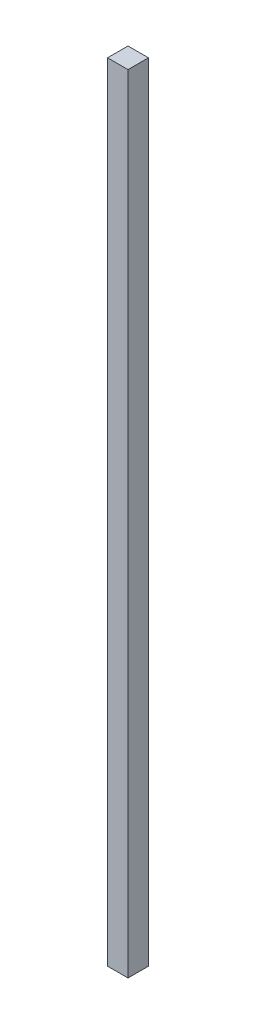
ISO-10303-21;
HEADER;
FILE_DESCRIPTION(('STEP AP214'),'2;1');
FILE_NAME('part.step','',(''),(''),'','','');
FILE_SCHEMA(('AUTOMOTIVE_DESIGN { 1 0 10303 214 1 1 1 1 }'));
ENDSEC;
DATA;
#1=APPLICATION_CONTEXT('core data for automotive mechanical design processes');
#2=APPLICATION_PROTOCOL_DEFINITION('international standard','automotive_design',2000,#1);
#3=PRODUCT_CONTEXT('',#1,'mechanical');
#4=PRODUCT('Part','Part','',(#3));
#5=PRODUCT_RELATED_PRODUCT_CATEGORY('part','',(#4));
#6=PRODUCT_DEFINITION_FORMATION('','',#4);
#7=PRODUCT_DEFINITION_CONTEXT('part definition',#1,'design');
#8=PRODUCT_DEFINITION('design','',#6,#7);
#9=PRODUCT_DEFINITION_SHAPE('','',#8);
#10=(LENGTH_UNIT() NAMED_UNIT(*) SI_UNIT(.MILLI.,.METRE.));
#11=(NAMED_UNIT(*) PLANE_ANGLE_UNIT() SI_UNIT($,.RADIAN.));
#12=(NAMED_UNIT(*) SI_UNIT($,.STERADIAN.) SOLID_ANGLE_UNIT());
#13=UNCERTAINTY_MEASURE_WITH_UNIT(LENGTH_MEASURE(1.E-05),#10,'distance_accuracy_value','');
#14=(GEOMETRIC_REPRESENTATION_CONTEXT(3) GLOBAL_UNCERTAINTY_ASSIGNED_CONTEXT((#13)) GLOBAL_UNIT_ASSIGNED_CONTEXT((#10,
#11,#12)) REPRESENTATION_CONTEXT('',''));
#15=CARTESIAN_POINT('',(0.,0.,0.));
#16=DIRECTION('',(0.,0.,1.));
#17=DIRECTION('',(1.,0.,0.));
#18=AXIS2_PLACEMENT_3D('',#15,#16,#17);
#19=CARTESIAN_POINT('',(6.35,244.475,6.35000000000002));
#20=DIRECTION('',(-1.,0.,0.));
#21=DIRECTION('',(0.,0.,1.));
#22=AXIS2_PLACEMENT_3D('',#19,#20,#21);
#23=PLANE('',#22);
#24=DIRECTION('',(0.,0.,-1.));
#25=VECTOR('',#24,1.);
#26=CARTESIAN_POINT('',(6.35,-244.475,6.35000000000002));
#27=LINE('',#26,#25);
#28=CARTESIAN_POINT('',(6.35,-244.475,6.35000000000002));
#29=VERTEX_POINT('',#28);
#30=CARTESIAN_POINT('',(6.35,-244.475,-6.35000000000002));
#31=VERTEX_POINT('',#30);
#32=EDGE_CURVE('E107',#29,#31,#27,.T.);
#33=ORIENTED_EDGE('',*,*,#32,.T.);
#34=DIRECTION('',(0.,-1.,0.));
#35=VECTOR('',#34,1.);
#36=CARTESIAN_POINT('',(6.35,244.475,-6.35000000000002));
#37=LINE('',#36,#35);
#38=CARTESIAN_POINT('',(6.35,244.475,-6.35000000000002));
#39=VERTEX_POINT('',#38);
#40=EDGE_CURVE('E11',#39,#31,#37,.T.);
#41=ORIENTED_EDGE('',*,*,#40,.F.);
#42=DIRECTION('',(0.,0.,-1.));
#43=VECTOR('',#42,1.);
#44=CARTESIAN_POINT('',(6.35,244.475,6.35000000000002));
#45=LINE('',#44,#43);
#46=CARTESIAN_POINT('',(6.35,244.475,6.35000000000002));
#47=VERTEX_POINT('',#46);
#48=EDGE_CURVE('E91',#47,#39,#45,.T.);
#49=ORIENTED_EDGE('',*,*,#48,.F.);
#50=DIRECTION('',(0.,-1.,0.));
#51=VECTOR('',#50,1.);
#52=CARTESIAN_POINT('',(6.35,244.475,6.35000000000002));
#53=LINE('',#52,#51);
#54=EDGE_CURVE('E103',#47,#29,#53,.T.);
#55=ORIENTED_EDGE('',*,*,#54,.T.);
#56=EDGE_LOOP('',(#33,#41,#49,#55));
#57=FACE_BOUND('',#56,.T.);
#58=ADVANCED_FACE('F39',(#57),#23,.F.);
#59=CARTESIAN_POINT('',(-6.35,244.475,-6.35000000000002));
#60=DIRECTION('',(0.,0.,1.));
#61=DIRECTION('',(1.,0.,0.));
#62=AXIS2_PLACEMENT_3D('',#59,#60,#61);
#63=PLANE('',#62);
#64=DIRECTION('',(-1.,0.,0.));
#65=VECTOR('',#64,1.);
#66=CARTESIAN_POINT('',(-6.35,-244.475,-6.35000000000002));
#67=LINE('',#66,#65);
#68=CARTESIAN_POINT('',(-6.35,-244.475,-6.35000000000002));
#69=VERTEX_POINT('',#68);
#70=EDGE_CURVE('E96',#31,#69,#67,.T.);
#71=ORIENTED_EDGE('',*,*,#70,.T.);
#72=DIRECTION('',(0.,-1.,0.));
#73=VECTOR('',#72,1.);
#74=CARTESIAN_POINT('',(-6.35,244.475,-6.35000000000002));
#75=LINE('',#74,#73);
#76=CARTESIAN_POINT('',(-6.35,244.475,-6.35000000000002));
#77=VERTEX_POINT('',#76);
#78=EDGE_CURVE('E48',#77,#69,#75,.T.);
#79=ORIENTED_EDGE('',*,*,#78,.F.);
#80=DIRECTION('',(-1.,0.,0.));
#81=VECTOR('',#80,1.);
#82=CARTESIAN_POINT('',(-6.35,244.475,-6.35000000000002));
#83=LINE('',#82,#81);
#84=EDGE_CURVE('E86',#39,#77,#83,.T.);
#85=ORIENTED_EDGE('',*,*,#84,.F.);
#86=ORIENTED_EDGE('',*,*,#40,.T.);
#87=EDGE_LOOP('',(#71,#79,#85,#86));
#88=FACE_BOUND('',#87,.T.);
#89=ADVANCED_FACE('F95',(#88),#63,.F.);
#90=CARTESIAN_POINT('',(-6.35,244.475,6.35000000000002));
#91=DIRECTION('',(1.,0.,0.));
#92=DIRECTION('',(0.,0.,-1.));
#93=AXIS2_PLACEMENT_3D('',#90,#91,#92);
#94=PLANE('',#93);
#95=DIRECTION('',(0.,0.,1.));
#96=VECTOR('',#95,1.);
#97=CARTESIAN_POINT('',(-6.35,-244.475,6.35000000000002));
#98=LINE('',#97,#96);
#99=CARTESIAN_POINT('',(-6.35,-244.475,6.35000000000002));
#100=VERTEX_POINT('',#99);
#101=EDGE_CURVE('E73',#69,#100,#98,.T.);
#102=ORIENTED_EDGE('',*,*,#101,.T.);
#103=DIRECTION('',(0.,-1.,0.));
#104=VECTOR('',#103,1.);
#105=CARTESIAN_POINT('',(-6.35,244.475,6.35000000000002));
#106=LINE('',#105,#104);
#107=CARTESIAN_POINT('',(-6.35,244.475,6.35000000000002));
#108=VERTEX_POINT('',#107);
#109=EDGE_CURVE('E98',#108,#100,#106,.T.);
#110=ORIENTED_EDGE('',*,*,#109,.F.);
#111=DIRECTION('',(0.,0.,1.));
#112=VECTOR('',#111,1.);
#113=CARTESIAN_POINT('',(-6.35,244.475,6.35000000000002));
#114=LINE('',#113,#112);
#115=EDGE_CURVE('E89',#77,#108,#114,.T.);
#116=ORIENTED_EDGE('',*,*,#115,.F.);
#117=ORIENTED_EDGE('',*,*,#78,.T.);
#118=EDGE_LOOP('',(#102,#110,#116,#117));
#119=FACE_BOUND('',#118,.T.);
#120=ADVANCED_FACE('F99',(#119),#94,.F.);
#121=CARTESIAN_POINT('',(-6.35,244.475,6.35000000000002));
#122=DIRECTION('',(0.,0.,-1.));
#123=DIRECTION('',(-1.,0.,0.));
#124=AXIS2_PLACEMENT_3D('',#121,#122,#123);
#125=PLANE('',#124);
#126=DIRECTION('',(1.,0.,0.));
#127=VECTOR('',#126,1.);
#128=CARTESIAN_POINT('',(-6.35,-244.475,6.35000000000002));
#129=LINE('',#128,#127);
#130=EDGE_CURVE('E79',#100,#29,#129,.T.);
#131=ORIENTED_EDGE('',*,*,#130,.T.);
#132=ORIENTED_EDGE('',*,*,#54,.F.);
#133=DIRECTION('',(1.,0.,0.));
#134=VECTOR('',#133,1.);
#135=CARTESIAN_POINT('',(-6.35,244.475,6.35000000000002));
#136=LINE('',#135,#134);
#137=EDGE_CURVE('E56',#108,#47,#136,.T.);
#138=ORIENTED_EDGE('',*,*,#137,.F.);
#139=ORIENTED_EDGE('',*,*,#109,.T.);
#140=EDGE_LOOP('',(#131,#132,#138,#139));
#141=FACE_BOUND('',#140,.T.);
#142=ADVANCED_FACE('F120',(#141),#125,.F.);
#143=CARTESIAN_POINT('',(0.,244.475,0.));
#144=DIRECTION('',(0.,-1.,0.));
#145=DIRECTION('',(0.,0.,-1.));
#146=AXIS2_PLACEMENT_3D('',#143,#144,#145);
#147=PLANE('',#146);
#148=ORIENTED_EDGE('',*,*,#48,.T.);
#149=ORIENTED_EDGE('',*,*,#84,.T.);
#150=ORIENTED_EDGE('',*,*,#115,.T.);
#151=ORIENTED_EDGE('',*,*,#137,.T.);
#152=EDGE_LOOP('',(#148,#149,#150,#151));
#153=FACE_BOUND('',#152,.T.);
#154=ADVANCED_FACE('F87',(#153),#147,.F.);
#155=CARTESIAN_POINT('',(0.,-244.475,0.));
#156=DIRECTION('',(0.,-1.,0.));
#157=DIRECTION('',(0.,0.,-1.));
#158=AXIS2_PLACEMENT_3D('',#155,#156,#157);
#159=PLANE('',#158);
#160=ORIENTED_EDGE('',*,*,#32,.F.);
#161=ORIENTED_EDGE('',*,*,#130,.F.);
#162=ORIENTED_EDGE('',*,*,#101,.F.);
#163=ORIENTED_EDGE('',*,*,#70,.F.);
#164=EDGE_LOOP('',(#160,#161,#162,#163));
#165=FACE_BOUND('',#164,.T.);
#166=ADVANCED_FACE('F123',(#165),#159,.T.);
#167=CLOSED_SHELL('',(#58,#89,#120,#142,#154,#166));
#168=MANIFOLD_SOLID_BREP('B2',#167);
#169=ADVANCED_BREP_SHAPE_REPRESENTATION('',(#18,#168),#14);
#170=SHAPE_DEFINITION_REPRESENTATION(#9,#169);
ENDSEC;
END-ISO-10303-21;
